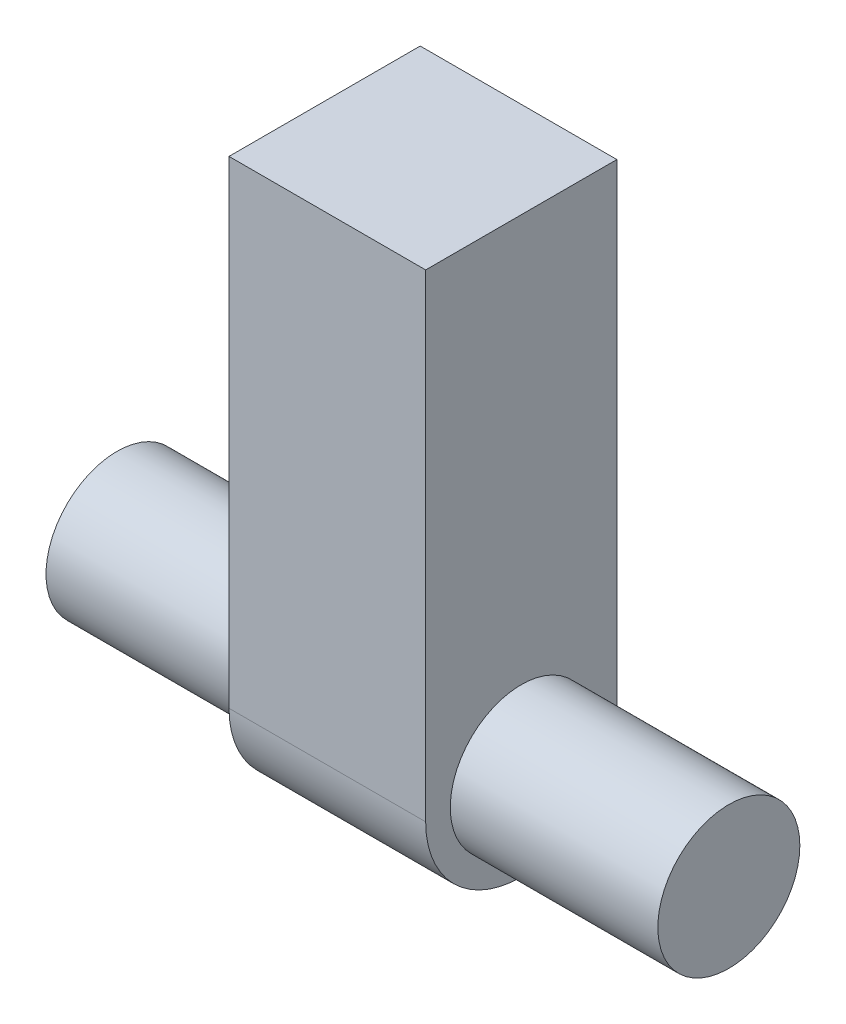
ISO-10303-21;
HEADER;
FILE_DESCRIPTION(('STEP AP214'),'2;1');
FILE_NAME('part.step','',(''),(''),'','','');
FILE_SCHEMA(('AUTOMOTIVE_DESIGN { 1 0 10303 214 1 1 1 1 }'));
ENDSEC;
DATA;
#1=APPLICATION_CONTEXT('core data for automotive mechanical design processes');
#2=APPLICATION_PROTOCOL_DEFINITION('international standard','automotive_design',2000,#1);
#3=PRODUCT_CONTEXT('',#1,'mechanical');
#4=PRODUCT('Part','Part','',(#3));
#5=PRODUCT_RELATED_PRODUCT_CATEGORY('part','',(#4));
#6=PRODUCT_DEFINITION_FORMATION('','',#4);
#7=PRODUCT_DEFINITION_CONTEXT('part definition',#1,'design');
#8=PRODUCT_DEFINITION('design','',#6,#7);
#9=PRODUCT_DEFINITION_SHAPE('','',#8);
#10=(LENGTH_UNIT() NAMED_UNIT(*) SI_UNIT(.MILLI.,.METRE.));
#11=(NAMED_UNIT(*) PLANE_ANGLE_UNIT() SI_UNIT($,.RADIAN.));
#12=(NAMED_UNIT(*) SI_UNIT($,.STERADIAN.) SOLID_ANGLE_UNIT());
#13=UNCERTAINTY_MEASURE_WITH_UNIT(LENGTH_MEASURE(1.E-05),#10,'distance_accuracy_value','');
#14=(GEOMETRIC_REPRESENTATION_CONTEXT(3) GLOBAL_UNCERTAINTY_ASSIGNED_CONTEXT((#13)) GLOBAL_UNIT_ASSIGNED_CONTEXT((#10,
#11,#12)) REPRESENTATION_CONTEXT('',''));
#15=CARTESIAN_POINT('',(0.,0.,0.));
#16=DIRECTION('',(0.,0.,1.));
#17=DIRECTION('',(1.,0.,0.));
#18=AXIS2_PLACEMENT_3D('',#15,#16,#17);
#19=CARTESIAN_POINT('',(24.05,0.,1.25));
#20=DIRECTION('',(0.,0.,-1.));
#21=DIRECTION('',(0.,-1.,0.));
#22=AXIS2_PLACEMENT_3D('',#19,#20,#21);
#23=PLANE('',#22);
#24=DIRECTION('',(0.,-1.,0.));
#25=VECTOR('',#24,1.);
#26=CARTESIAN_POINT('',(27.65,0.,1.25));
#27=LINE('',#26,#25);
#28=CARTESIAN_POINT('',(27.65,12.25,1.25));
#29=VERTEX_POINT('',#28);
#30=CARTESIAN_POINT('',(27.65,3.5,1.25));
#31=VERTEX_POINT('',#30);
#32=EDGE_CURVE('E128',#29,#31,#27,.T.);
#33=ORIENTED_EDGE('',*,*,#32,.T.);
#34=DIRECTION('',(1.,0.,0.));
#35=VECTOR('',#34,1.);
#36=CARTESIAN_POINT('',(24.05,3.5,1.25));
#37=LINE('',#36,#35);
#38=CARTESIAN_POINT('',(24.05,3.5,1.25));
#39=VERTEX_POINT('',#38);
#40=EDGE_CURVE('E117',#39,#31,#37,.T.);
#41=ORIENTED_EDGE('',*,*,#40,.F.);
#42=DIRECTION('',(0.,-1.,0.));
#43=VECTOR('',#42,1.);
#44=CARTESIAN_POINT('',(24.05,0.,1.25));
#45=LINE('',#44,#43);
#46=CARTESIAN_POINT('',(24.05,12.25,1.25));
#47=VERTEX_POINT('',#46);
#48=EDGE_CURVE('E97',#47,#39,#45,.T.);
#49=ORIENTED_EDGE('',*,*,#48,.F.);
#50=DIRECTION('',(1.,0.,0.));
#51=VECTOR('',#50,1.);
#52=CARTESIAN_POINT('',(24.05,12.25,1.25));
#53=LINE('',#52,#51);
#54=EDGE_CURVE('E106',#47,#29,#53,.T.);
#55=ORIENTED_EDGE('',*,*,#54,.T.);
#56=EDGE_LOOP('',(#33,#41,#49,#55));
#57=FACE_BOUND('',#56,.T.);
#58=ADVANCED_FACE('F49',(#57),#23,.T.);
#59=CARTESIAN_POINT('',(24.05,12.25,0.));
#60=DIRECTION('',(0.,1.,0.));
#61=DIRECTION('',(0.,0.,-1.));
#62=AXIS2_PLACEMENT_3D('',#59,#60,#61);
#63=PLANE('',#62);
#64=DIRECTION('',(0.,0.,-1.));
#65=VECTOR('',#64,1.);
#66=CARTESIAN_POINT('',(27.65,12.25,0.));
#67=LINE('',#66,#65);
#68=CARTESIAN_POINT('',(27.65,12.25,4.75));
#69=VERTEX_POINT('',#68);
#70=EDGE_CURVE('E109',#69,#29,#67,.T.);
#71=ORIENTED_EDGE('',*,*,#70,.T.);
#72=ORIENTED_EDGE('',*,*,#54,.F.);
#73=DIRECTION('',(0.,0.,-1.));
#74=VECTOR('',#73,1.);
#75=CARTESIAN_POINT('',(24.05,12.25,0.));
#76=LINE('',#75,#74);
#77=CARTESIAN_POINT('',(24.05,12.25,4.75));
#78=VERTEX_POINT('',#77);
#79=EDGE_CURVE('E93',#78,#47,#76,.T.);
#80=ORIENTED_EDGE('',*,*,#79,.F.);
#81=DIRECTION('',(1.,0.,0.));
#82=VECTOR('',#81,1.);
#83=CARTESIAN_POINT('',(24.05,12.25,4.75));
#84=LINE('',#83,#82);
#85=EDGE_CURVE('E114',#78,#69,#84,.T.);
#86=ORIENTED_EDGE('',*,*,#85,.T.);
#87=EDGE_LOOP('',(#71,#72,#80,#86));
#88=FACE_BOUND('',#87,.T.);
#89=ADVANCED_FACE('F107',(#88),#63,.T.);
#90=CARTESIAN_POINT('',(24.05,0.,4.75));
#91=DIRECTION('',(0.,0.,1.));
#92=DIRECTION('',(-1.,0.,0.));
#93=AXIS2_PLACEMENT_3D('',#90,#91,#92);
#94=PLANE('',#93);
#95=DIRECTION('',(0.,1.,0.));
#96=VECTOR('',#95,1.);
#97=CARTESIAN_POINT('',(27.65,0.,4.75));
#98=LINE('',#97,#96);
#99=CARTESIAN_POINT('',(27.65,3.5,4.75));
#100=VERTEX_POINT('',#99);
#101=EDGE_CURVE('E120',#100,#69,#98,.T.);
#102=ORIENTED_EDGE('',*,*,#101,.T.);
#103=ORIENTED_EDGE('',*,*,#85,.F.);
#104=DIRECTION('',(0.,1.,0.));
#105=VECTOR('',#104,1.);
#106=CARTESIAN_POINT('',(24.05,0.,4.75));
#107=LINE('',#106,#105);
#108=CARTESIAN_POINT('',(24.05,3.5,4.75));
#109=VERTEX_POINT('',#108);
#110=EDGE_CURVE('E100',#109,#78,#107,.T.);
#111=ORIENTED_EDGE('',*,*,#110,.F.);
#112=DIRECTION('',(1.,0.,0.));
#113=VECTOR('',#112,1.);
#114=CARTESIAN_POINT('',(24.05,3.5,4.75));
#115=LINE('',#114,#113);
#116=EDGE_CURVE('E57',#100,#109,#115,.F.);
#117=ORIENTED_EDGE('',*,*,#116,.F.);
#118=EDGE_LOOP('',(#102,#103,#111,#117));
#119=FACE_BOUND('',#118,.T.);
#120=ADVANCED_FACE('F142',(#119),#94,.T.);
#121=CARTESIAN_POINT('',(24.05,3.5,3.));
#122=DIRECTION('',(1.,0.,0.));
#123=DIRECTION('',(0.,0.,1.));
#124=AXIS2_PLACEMENT_3D('',#121,#122,#123);
#125=CYLINDRICAL_SURFACE('',#124,1.75);
#126=CARTESIAN_POINT('',(27.65,3.5,3.));
#127=DIRECTION('',(1.,0.,0.));
#128=DIRECTION('',(0.,0.,-1.));
#129=AXIS2_PLACEMENT_3D('',#126,#127,#128);
#130=CIRCLE('',#129,1.75);
#131=CARTESIAN_POINT('',(27.65,1.75,3.));
#132=VERTEX_POINT('',#131);
#133=EDGE_CURVE('E118',#132,#31,#130,.T.);
#134=ORIENTED_EDGE('',*,*,#133,.F.);
#135=DIRECTION('',(1.,0.,0.));
#136=VECTOR('',#135,1.);
#137=CARTESIAN_POINT('',(24.05,1.75,3.));
#138=LINE('',#137,#136);
#139=CARTESIAN_POINT('',(24.05,1.75,3.));
#140=VERTEX_POINT('',#139);
#141=EDGE_CURVE('E134',#140,#132,#138,.T.);
#142=ORIENTED_EDGE('',*,*,#141,.F.);
#143=CARTESIAN_POINT('',(24.05,3.5,3.));
#144=DIRECTION('',(1.,0.,0.));
#145=DIRECTION('',(0.,0.,-1.));
#146=AXIS2_PLACEMENT_3D('',#143,#144,#145);
#147=CIRCLE('',#146,1.75);
#148=EDGE_CURVE('E126',#140,#39,#147,.T.);
#149=ORIENTED_EDGE('',*,*,#148,.T.);
#150=ORIENTED_EDGE('',*,*,#40,.T.);
#151=EDGE_LOOP('',(#134,#142,#149,#150));
#152=FACE_BOUND('',#151,.T.);
#153=ADVANCED_FACE('F148',(#152),#125,.T.);
#154=CARTESIAN_POINT('',(24.05,0.,0.));
#155=DIRECTION('',(-1.,0.,0.));
#156=DIRECTION('',(0.,0.,-1.));
#157=AXIS2_PLACEMENT_3D('',#154,#155,#156);
#158=PLANE('',#157);
#159=CARTESIAN_POINT('',(24.05,3.5,3.));
#160=DIRECTION('',(1.,0.,0.));
#161=DIRECTION('',(0.,0.,-1.));
#162=AXIS2_PLACEMENT_3D('',#159,#160,#161);
#163=CIRCLE('',#162,1.3);
#164=CARTESIAN_POINT('',(24.05,3.5,1.7));
#165=VERTEX_POINT('',#164);
#166=EDGE_CURVE('E113',#165,#165,#163,.T.);
#167=ORIENTED_EDGE('',*,*,#166,.T.);
#168=EDGE_LOOP('',(#167));
#169=FACE_BOUND('',#168,.T.);
#170=ORIENTED_EDGE('',*,*,#110,.T.);
#171=ORIENTED_EDGE('',*,*,#79,.T.);
#172=ORIENTED_EDGE('',*,*,#48,.T.);
#173=ORIENTED_EDGE('',*,*,#148,.F.);
#174=CARTESIAN_POINT('',(24.05,3.5,3.));
#175=DIRECTION('',(1.,0.,0.));
#176=DIRECTION('',(0.,0.,-1.));
#177=AXIS2_PLACEMENT_3D('',#174,#175,#176);
#178=CIRCLE('',#177,1.75);
#179=EDGE_CURVE('E11',#109,#140,#178,.T.);
#180=ORIENTED_EDGE('',*,*,#179,.F.);
#181=EDGE_LOOP('',(#170,#171,#172,#173,#180));
#182=FACE_BOUND('',#181,.T.);
#183=ADVANCED_FACE('F95',(#169,#182),#158,.T.);
#184=CARTESIAN_POINT('',(27.65,0.,0.));
#185=DIRECTION('',(-1.,0.,0.));
#186=DIRECTION('',(0.,0.,-1.));
#187=AXIS2_PLACEMENT_3D('',#184,#185,#186);
#188=PLANE('',#187);
#189=CARTESIAN_POINT('',(27.65,3.5,3.));
#190=DIRECTION('',(1.,0.,0.));
#191=DIRECTION('',(0.,0.,-1.));
#192=AXIS2_PLACEMENT_3D('',#189,#190,#191);
#193=CIRCLE('',#192,1.3);
#194=CARTESIAN_POINT('',(27.65,3.5,1.7));
#195=VERTEX_POINT('',#194);
#196=EDGE_CURVE('E130',#195,#195,#193,.T.);
#197=ORIENTED_EDGE('',*,*,#196,.F.);
#198=EDGE_LOOP('',(#197));
#199=FACE_BOUND('',#198,.T.);
#200=ORIENTED_EDGE('',*,*,#133,.T.);
#201=ORIENTED_EDGE('',*,*,#32,.F.);
#202=ORIENTED_EDGE('',*,*,#70,.F.);
#203=ORIENTED_EDGE('',*,*,#101,.F.);
#204=CARTESIAN_POINT('',(27.65,3.5,3.));
#205=DIRECTION('',(1.,0.,0.));
#206=DIRECTION('',(0.,0.,-1.));
#207=AXIS2_PLACEMENT_3D('',#204,#205,#206);
#208=CIRCLE('',#207,1.75);
#209=EDGE_CURVE('E69',#132,#100,#208,.F.);
#210=ORIENTED_EDGE('',*,*,#209,.F.);
#211=EDGE_LOOP('',(#200,#201,#202,#203,#210));
#212=FACE_BOUND('',#211,.T.);
#213=ADVANCED_FACE('F144',(#199,#212),#188,.F.);
#214=CARTESIAN_POINT('',(31.45,3.5,3.));
#215=DIRECTION('',(-1.,0.,0.));
#216=DIRECTION('',(0.,0.,-1.));
#217=AXIS2_PLACEMENT_3D('',#214,#215,#216);
#218=PLANE('',#217);
#219=CARTESIAN_POINT('',(31.45,3.5,3.));
#220=DIRECTION('',(1.,0.,0.));
#221=DIRECTION('',(0.,0.,-1.));
#222=AXIS2_PLACEMENT_3D('',#219,#220,#221);
#223=CIRCLE('',#222,1.3);
#224=CARTESIAN_POINT('',(31.45,3.5,1.7));
#225=VERTEX_POINT('',#224);
#226=EDGE_CURVE('E139',#225,#225,#223,.T.);
#227=ORIENTED_EDGE('',*,*,#226,.T.);
#228=EDGE_LOOP('',(#227));
#229=FACE_BOUND('',#228,.T.);
#230=ADVANCED_FACE('F200',(#229),#218,.F.);
#231=CARTESIAN_POINT('',(31.45,3.5,3.));
#232=DIRECTION('',(-1.,0.,0.));
#233=DIRECTION('',(0.,0.,-1.));
#234=AXIS2_PLACEMENT_3D('',#231,#232,#233);
#235=CYLINDRICAL_SURFACE('',#234,1.3);
#236=ORIENTED_EDGE('',*,*,#226,.F.);
#237=EDGE_LOOP('',(#236));
#238=FACE_BOUND('',#237,.T.);
#239=ORIENTED_EDGE('',*,*,#196,.T.);
#240=EDGE_LOOP('',(#239));
#241=FACE_BOUND('',#240,.T.);
#242=ADVANCED_FACE('F214',(#238,#241),#235,.T.);
#243=ORIENTED_EDGE('',*,*,#166,.F.);
#244=EDGE_LOOP('',(#243));
#245=FACE_BOUND('',#244,.T.);
#246=CARTESIAN_POINT('',(20.25,3.5,3.));
#247=DIRECTION('',(1.,0.,0.));
#248=DIRECTION('',(0.,0.,-1.));
#249=AXIS2_PLACEMENT_3D('',#246,#247,#248);
#250=CIRCLE('',#249,1.3);
#251=CARTESIAN_POINT('',(20.25,3.5,1.7));
#252=VERTEX_POINT('',#251);
#253=EDGE_CURVE('E256',#252,#252,#250,.T.);
#254=ORIENTED_EDGE('',*,*,#253,.T.);
#255=EDGE_LOOP('',(#254));
#256=FACE_BOUND('',#255,.T.);
#257=ADVANCED_FACE('F225',(#245,#256),#235,.T.);
#258=CARTESIAN_POINT('',(20.25,3.5,3.));
#259=DIRECTION('',(-1.,0.,0.));
#260=DIRECTION('',(0.,0.,-1.));
#261=AXIS2_PLACEMENT_3D('',#258,#259,#260);
#262=PLANE('',#261);
#263=ORIENTED_EDGE('',*,*,#253,.F.);
#264=EDGE_LOOP('',(#263));
#265=FACE_BOUND('',#264,.T.);
#266=ADVANCED_FACE('F237',(#265),#262,.T.);
#267=CARTESIAN_POINT('',(24.05,3.5,3.));
#268=DIRECTION('',(-1.,0.,0.));
#269=DIRECTION('',(0.,0.,-1.));
#270=AXIS2_PLACEMENT_3D('',#267,#268,#269);
#271=CYLINDRICAL_SURFACE('',#270,1.75);
#272=ORIENTED_EDGE('',*,*,#179,.T.);
#273=ORIENTED_EDGE('',*,*,#141,.T.);
#274=ORIENTED_EDGE('',*,*,#209,.T.);
#275=ORIENTED_EDGE('',*,*,#116,.T.);
#276=EDGE_LOOP('',(#272,#273,#274,#275));
#277=FACE_BOUND('',#276,.T.);
#278=ADVANCED_FACE('F51',(#277),#271,.T.);
#279=CLOSED_SHELL('',(#58,#89,#120,#153,#183,#213,#230,#242,#257,#266,#278));
#280=MANIFOLD_SOLID_BREP('B2',#279);
#281=ADVANCED_BREP_SHAPE_REPRESENTATION('',(#18,#280),#14);
#282=SHAPE_DEFINITION_REPRESENTATION(#9,#281);
ENDSEC;
END-ISO-10303-21;
